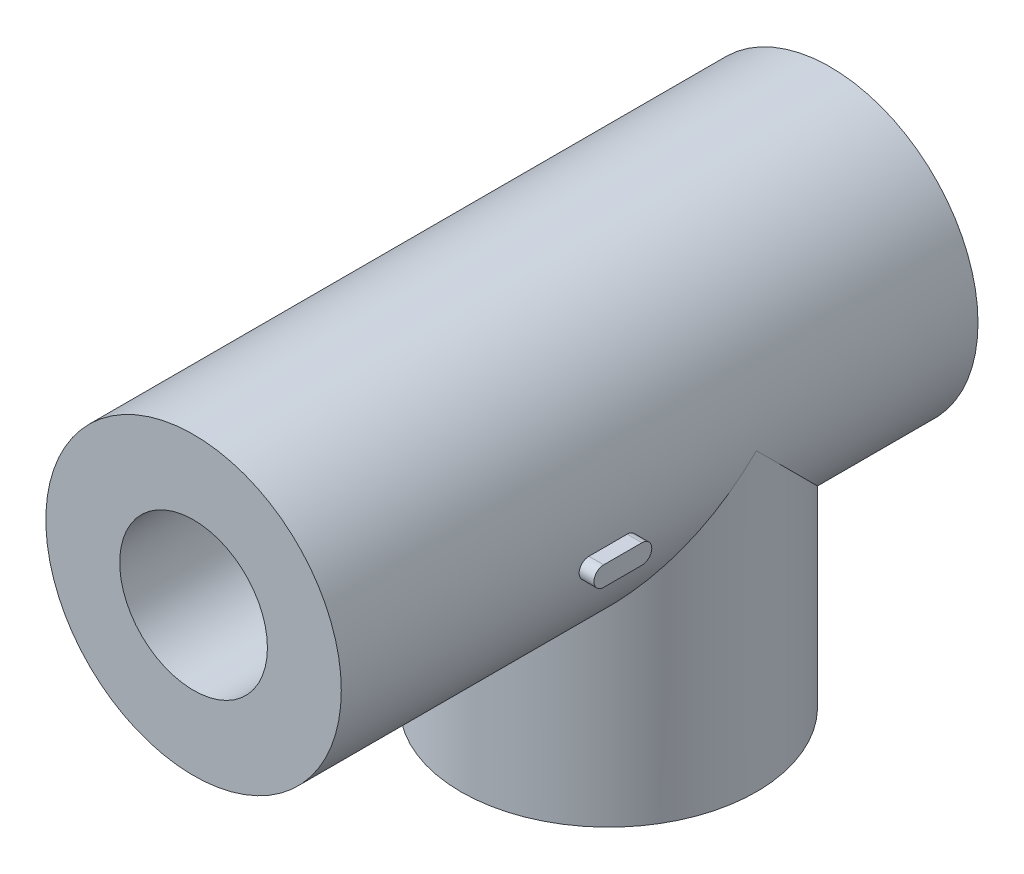
ISO-10303-21;
HEADER;
FILE_DESCRIPTION(('STEP AP214'),'2;1');
FILE_NAME('part.step','',(''),(''),'','','');
FILE_SCHEMA(('AUTOMOTIVE_DESIGN { 1 0 10303 214 1 1 1 1 }'));
ENDSEC;
DATA;
#1=APPLICATION_CONTEXT('core data for automotive mechanical design processes');
#2=APPLICATION_PROTOCOL_DEFINITION('international standard','automotive_design',2000,#1);
#3=PRODUCT_CONTEXT('',#1,'mechanical');
#4=PRODUCT('Part','Part','',(#3));
#5=PRODUCT_RELATED_PRODUCT_CATEGORY('part','',(#4));
#6=PRODUCT_DEFINITION_FORMATION('','',#4);
#7=PRODUCT_DEFINITION_CONTEXT('part definition',#1,'design');
#8=PRODUCT_DEFINITION('design','',#6,#7);
#9=PRODUCT_DEFINITION_SHAPE('','',#8);
#10=(LENGTH_UNIT() NAMED_UNIT(*) SI_UNIT(.MILLI.,.METRE.));
#11=(NAMED_UNIT(*) PLANE_ANGLE_UNIT() SI_UNIT($,.RADIAN.));
#12=(NAMED_UNIT(*) SI_UNIT($,.STERADIAN.) SOLID_ANGLE_UNIT());
#13=UNCERTAINTY_MEASURE_WITH_UNIT(LENGTH_MEASURE(1.E-05),#10,'distance_accuracy_value','');
#14=(GEOMETRIC_REPRESENTATION_CONTEXT(3) GLOBAL_UNCERTAINTY_ASSIGNED_CONTEXT((#13)) GLOBAL_UNIT_ASSIGNED_CONTEXT((#10,
#11,#12)) REPRESENTATION_CONTEXT('',''));
#15=CARTESIAN_POINT('',(0.,0.,0.));
#16=DIRECTION('',(0.,0.,1.));
#17=DIRECTION('',(1.,0.,0.));
#18=AXIS2_PLACEMENT_3D('',#15,#16,#17);
#19=CARTESIAN_POINT('',(22.,-2.35876012931021,52.675133912037));
#20=DIRECTION('',(-1.,0.,0.));
#21=DIRECTION('',(0.,0.,1.));
#22=AXIS2_PLACEMENT_3D('',#19,#20,#21);
#23=CYLINDRICAL_SURFACE('',#22,1.32070812579821);
#24=CARTESIAN_POINT('',(20.,-2.35876012931021,52.675133912037));
#25=DIRECTION('',(1.,0.,0.));
#26=DIRECTION('',(0.,0.,-1.));
#27=AXIS2_PLACEMENT_3D('',#24,#25,#26);
#28=CIRCLE('',#27,1.32070812579821);
#29=CARTESIAN_POINT('',(20.,-1.038052003512,52.675133912037));
#30=VERTEX_POINT('',#29);
#31=CARTESIAN_POINT('',(20.,-3.67946825510842,52.675133912037));
#32=VERTEX_POINT('',#31);
#33=EDGE_CURVE('E117',#30,#32,#28,.T.);
#34=ORIENTED_EDGE('',*,*,#33,.T.);
#35=DIRECTION('',(-1.,0.,0.));
#36=VECTOR('',#35,1.);
#37=CARTESIAN_POINT('',(22.,-3.67946825510842,52.675133912037));
#38=LINE('',#37,#36);
#39=CARTESIAN_POINT('',(22.,-3.67946825510842,52.675133912037));
#40=VERTEX_POINT('',#39);
#41=EDGE_CURVE('E12',#40,#32,#38,.T.);
#42=ORIENTED_EDGE('',*,*,#41,.F.);
#43=CARTESIAN_POINT('',(22.,-2.35876012931021,52.675133912037));
#44=DIRECTION('',(1.,0.,0.));
#45=DIRECTION('',(0.,0.,-1.));
#46=AXIS2_PLACEMENT_3D('',#43,#44,#45);
#47=CIRCLE('',#46,1.32070812579821);
#48=CARTESIAN_POINT('',(22.,-1.038052003512,52.675133912037));
#49=VERTEX_POINT('',#48);
#50=EDGE_CURVE('E105',#49,#40,#47,.T.);
#51=ORIENTED_EDGE('',*,*,#50,.F.);
#52=DIRECTION('',(-1.,0.,0.));
#53=VECTOR('',#52,1.);
#54=CARTESIAN_POINT('',(22.,-1.038052003512,52.675133912037));
#55=LINE('',#54,#53);
#56=EDGE_CURVE('E113',#49,#30,#55,.T.);
#57=ORIENTED_EDGE('',*,*,#56,.T.);
#58=EDGE_LOOP('',(#34,#42,#51,#57));
#59=FACE_BOUND('',#58,.T.);
#60=ADVANCED_FACE('F54',(#59),#23,.T.);
#61=CARTESIAN_POINT('',(22.,-3.67946825510842,52.675133912037));
#62=DIRECTION('',(0.,1.,0.));
#63=DIRECTION('',(0.,0.,1.));
#64=AXIS2_PLACEMENT_3D('',#61,#62,#63);
#65=PLANE('',#64);
#66=DIRECTION('',(0.,0.,-1.));
#67=VECTOR('',#66,1.);
#68=CARTESIAN_POINT('',(20.,-3.67946825510842,52.675133912037));
#69=LINE('',#68,#67);
#70=CARTESIAN_POINT('',(20.,-3.67946825510842,47.4866377035441));
#71=VERTEX_POINT('',#70);
#72=EDGE_CURVE('E109',#32,#71,#69,.T.);
#73=ORIENTED_EDGE('',*,*,#72,.T.);
#74=DIRECTION('',(-1.,0.,0.));
#75=VECTOR('',#74,1.);
#76=CARTESIAN_POINT('',(22.,-3.67946825510842,47.4866377035441));
#77=LINE('',#76,#75);
#78=CARTESIAN_POINT('',(22.,-3.67946825510842,47.4866377035441));
#79=VERTEX_POINT('',#78);
#80=EDGE_CURVE('E62',#79,#71,#77,.T.);
#81=ORIENTED_EDGE('',*,*,#80,.F.);
#82=DIRECTION('',(0.,0.,-1.));
#83=VECTOR('',#82,1.);
#84=CARTESIAN_POINT('',(22.,-3.67946825510842,52.675133912037));
#85=LINE('',#84,#83);
#86=EDGE_CURVE('E100',#40,#79,#85,.T.);
#87=ORIENTED_EDGE('',*,*,#86,.F.);
#88=ORIENTED_EDGE('',*,*,#41,.T.);
#89=EDGE_LOOP('',(#73,#81,#87,#88));
#90=FACE_BOUND('',#89,.T.);
#91=ADVANCED_FACE('F108',(#90),#65,.F.);
#92=CARTESIAN_POINT('',(22.,-2.35876012931021,47.4866377035441));
#93=DIRECTION('',(-1.,0.,0.));
#94=DIRECTION('',(0.,0.,1.));
#95=AXIS2_PLACEMENT_3D('',#92,#93,#94);
#96=CYLINDRICAL_SURFACE('',#95,1.32070812579821);
#97=CARTESIAN_POINT('',(20.,-2.35876012931021,47.4866377035441));
#98=DIRECTION('',(1.,0.,0.));
#99=DIRECTION('',(0.,0.,-1.));
#100=AXIS2_PLACEMENT_3D('',#97,#98,#99);
#101=CIRCLE('',#100,1.32070812579821);
#102=CARTESIAN_POINT('',(20.,-1.038052003512,47.4866377035441));
#103=VERTEX_POINT('',#102);
#104=EDGE_CURVE('E87',#71,#103,#101,.T.);
#105=ORIENTED_EDGE('',*,*,#104,.T.);
#106=DIRECTION('',(-1.,0.,0.));
#107=VECTOR('',#106,1.);
#108=CARTESIAN_POINT('',(22.,-1.038052003512,47.4866377035441));
#109=LINE('',#108,#107);
#110=CARTESIAN_POINT('',(22.,-1.038052003512,47.4866377035441));
#111=VERTEX_POINT('',#110);
#112=EDGE_CURVE('E110',#111,#103,#109,.T.);
#113=ORIENTED_EDGE('',*,*,#112,.F.);
#114=CARTESIAN_POINT('',(22.,-2.35876012931021,47.4866377035441));
#115=DIRECTION('',(1.,0.,0.));
#116=DIRECTION('',(0.,0.,-1.));
#117=AXIS2_PLACEMENT_3D('',#114,#115,#116);
#118=CIRCLE('',#117,1.32070812579821);
#119=EDGE_CURVE('E103',#79,#111,#118,.T.);
#120=ORIENTED_EDGE('',*,*,#119,.F.);
#121=ORIENTED_EDGE('',*,*,#80,.T.);
#122=EDGE_LOOP('',(#105,#113,#120,#121));
#123=FACE_BOUND('',#122,.T.);
#124=ADVANCED_FACE('F111',(#123),#96,.T.);
#125=CARTESIAN_POINT('',(22.,-1.038052003512,52.675133912037));
#126=DIRECTION('',(0.,-1.,0.));
#127=DIRECTION('',(0.,0.,-1.));
#128=AXIS2_PLACEMENT_3D('',#125,#126,#127);
#129=PLANE('',#128);
#130=DIRECTION('',(0.,0.,1.));
#131=VECTOR('',#130,1.);
#132=CARTESIAN_POINT('',(20.,-1.038052003512,52.675133912037));
#133=LINE('',#132,#131);
#134=EDGE_CURVE('E93',#103,#30,#133,.T.);
#135=ORIENTED_EDGE('',*,*,#134,.T.);
#136=ORIENTED_EDGE('',*,*,#56,.F.);
#137=DIRECTION('',(0.,0.,1.));
#138=VECTOR('',#137,1.);
#139=CARTESIAN_POINT('',(22.,-1.038052003512,52.675133912037));
#140=LINE('',#139,#138);
#141=EDGE_CURVE('E70',#111,#49,#140,.T.);
#142=ORIENTED_EDGE('',*,*,#141,.F.);
#143=ORIENTED_EDGE('',*,*,#112,.T.);
#144=EDGE_LOOP('',(#135,#136,#142,#143));
#145=FACE_BOUND('',#144,.T.);
#146=ADVANCED_FACE('F124',(#145),#129,.F.);
#147=CARTESIAN_POINT('',(22.,-2.35876012931021,52.675133912037));
#148=DIRECTION('',(1.,0.,0.));
#149=DIRECTION('',(0.,0.,-1.));
#150=AXIS2_PLACEMENT_3D('',#147,#148,#149);
#151=PLANE('',#150);
#152=ORIENTED_EDGE('',*,*,#50,.T.);
#153=ORIENTED_EDGE('',*,*,#86,.T.);
#154=ORIENTED_EDGE('',*,*,#119,.T.);
#155=ORIENTED_EDGE('',*,*,#141,.T.);
#156=EDGE_LOOP('',(#152,#153,#154,#155));
#157=FACE_BOUND('',#156,.T.);
#158=ADVANCED_FACE('F101',(#157),#151,.T.);
#159=CARTESIAN_POINT('',(20.,-2.35876012931021,52.675133912037));
#160=DIRECTION('',(1.,0.,0.));
#161=DIRECTION('',(0.,0.,-1.));
#162=AXIS2_PLACEMENT_3D('',#159,#160,#161);
#163=PLANE('',#162);
#164=ORIENTED_EDGE('',*,*,#33,.F.);
#165=ORIENTED_EDGE('',*,*,#134,.F.);
#166=ORIENTED_EDGE('',*,*,#104,.F.);
#167=ORIENTED_EDGE('',*,*,#72,.F.);
#168=EDGE_LOOP('',(#164,#165,#166,#167));
#169=FACE_BOUND('',#168,.T.);
#170=ADVANCED_FACE('F127',(#169),#163,.F.);
#171=CLOSED_SHELL('',(#60,#91,#124,#146,#158,#170));
#172=MANIFOLD_SOLID_BREP('B2',#171);
#173=CARTESIAN_POINT('',(0.,0.,86.2));
#174=DIRECTION('',(0.,0.,-1.));
#175=DIRECTION('',(-1.,0.,0.));
#176=AXIS2_PLACEMENT_3D('',#173,#174,#175);
#177=CYLINDRICAL_SURFACE('',#176,20.);
#178=CARTESIAN_POINT('',(0.,0.,30.));
#179=DIRECTION('',(0.,-0.707106781186547,-0.707106781186547));
#180=DIRECTION('',(0.,0.707106781186547,-0.707106781186547));
#181=AXIS2_PLACEMENT_3D('',#178,#179,#180);
#182=ELLIPSE('',#181,28.2842712474619,20.);
#183=CARTESIAN_POINT('',(-20.,0.,30.));
#184=VERTEX_POINT('',#183);
#185=CARTESIAN_POINT('',(20.,0.,30.));
#186=VERTEX_POINT('',#185);
#187=EDGE_CURVE('E197',#184,#186,#182,.F.);
#188=ORIENTED_EDGE('',*,*,#187,.T.);
#189=CARTESIAN_POINT('',(0.,0.,30.));
#190=DIRECTION('',(0.,0.707106781186547,-0.707106781186547));
#191=DIRECTION('',(0.,-0.707106781186547,-0.707106781186547));
#192=AXIS2_PLACEMENT_3D('',#189,#190,#191);
#193=ELLIPSE('',#192,28.2842712474619,20.);
#194=EDGE_CURVE('E52',#186,#184,#193,.T.);
#195=ORIENTED_EDGE('',*,*,#194,.T.);
#196=EDGE_LOOP('',(#188,#195));
#197=FACE_BOUND('',#196,.T.);
#198=CARTESIAN_POINT('',(0.,0.,86.2));
#199=DIRECTION('',(0.,0.,1.));
#200=DIRECTION('',(1.,0.,0.));
#201=AXIS2_PLACEMENT_3D('',#198,#199,#200);
#202=CIRCLE('',#201,20.);
#203=CARTESIAN_POINT('',(20.,0.,86.2));
#204=VERTEX_POINT('',#203);
#205=EDGE_CURVE('E206',#204,#204,#202,.T.);
#206=ORIENTED_EDGE('',*,*,#205,.F.);
#207=EDGE_LOOP('',(#206));
#208=FACE_BOUND('',#207,.T.);
#209=CARTESIAN_POINT('',(0.,0.,0.));
#210=DIRECTION('',(0.,0.,1.));
#211=DIRECTION('',(1.,0.,0.));
#212=AXIS2_PLACEMENT_3D('',#209,#210,#211);
#213=CIRCLE('',#212,20.);
#214=CARTESIAN_POINT('',(20.,0.,0.));
#215=VERTEX_POINT('',#214);
#216=EDGE_CURVE('E215',#215,#215,#213,.T.);
#217=ORIENTED_EDGE('',*,*,#216,.T.);
#218=EDGE_LOOP('',(#217));
#219=FACE_BOUND('',#218,.T.);
#220=ADVANCED_FACE('F189',(#197,#208,#219),#177,.T.);
#221=CARTESIAN_POINT('',(0.,0.,86.2));
#222=DIRECTION('',(0.,0.,1.));
#223=DIRECTION('',(1.,0.,0.));
#224=AXIS2_PLACEMENT_3D('',#221,#222,#223);
#225=PLANE('',#224);
#226=CARTESIAN_POINT('',(0.,0.,86.2));
#227=DIRECTION('',(0.,0.,1.));
#228=DIRECTION('',(1.,0.,0.));
#229=AXIS2_PLACEMENT_3D('',#226,#227,#228);
#230=CIRCLE('',#229,10.);
#231=CARTESIAN_POINT('',(10.,0.,86.2));
#232=VERTEX_POINT('',#231);
#233=EDGE_CURVE('E235',#232,#232,#230,.T.);
#234=ORIENTED_EDGE('',*,*,#233,.F.);
#235=EDGE_LOOP('',(#234));
#236=FACE_BOUND('',#235,.T.);
#237=ORIENTED_EDGE('',*,*,#205,.T.);
#238=EDGE_LOOP('',(#237));
#239=FACE_BOUND('',#238,.T.);
#240=ADVANCED_FACE('F209',(#236,#239),#225,.T.);
#241=CARTESIAN_POINT('',(0.,0.,0.));
#242=DIRECTION('',(0.,0.,1.));
#243=DIRECTION('',(1.,0.,0.));
#244=AXIS2_PLACEMENT_3D('',#241,#242,#243);
#245=PLANE('',#244);
#246=ORIENTED_EDGE('',*,*,#216,.F.);
#247=EDGE_LOOP('',(#246));
#248=FACE_BOUND('',#247,.T.);
#249=ADVANCED_FACE('F254',(#248),#245,.F.);
#250=CARTESIAN_POINT('',(0.,-40.,30.));
#251=DIRECTION('',(0.,1.,0.));
#252=DIRECTION('',(0.,0.,1.));
#253=AXIS2_PLACEMENT_3D('',#250,#251,#252);
#254=CYLINDRICAL_SURFACE('',#253,20.);
#255=CARTESIAN_POINT('',(0.,-40.,30.));
#256=DIRECTION('',(0.,1.,0.));
#257=DIRECTION('',(0.,0.,1.));
#258=AXIS2_PLACEMENT_3D('',#255,#256,#257);
#259=CIRCLE('',#258,20.);
#260=CARTESIAN_POINT('',(0.,-40.,50.));
#261=VERTEX_POINT('',#260);
#262=EDGE_CURVE('E218',#261,#261,#259,.T.);
#263=ORIENTED_EDGE('',*,*,#262,.T.);
#264=EDGE_LOOP('',(#263));
#265=FACE_BOUND('',#264,.T.);
#266=ORIENTED_EDGE('',*,*,#194,.F.);
#267=ORIENTED_EDGE('',*,*,#187,.F.);
#268=EDGE_LOOP('',(#266,#267));
#269=FACE_BOUND('',#268,.T.);
#270=ADVANCED_FACE('F203',(#265,#269),#254,.T.);
#271=CARTESIAN_POINT('',(0.,-40.,30.));
#272=DIRECTION('',(0.,1.,0.));
#273=DIRECTION('',(0.,0.,1.));
#274=AXIS2_PLACEMENT_3D('',#271,#272,#273);
#275=PLANE('',#274);
#276=CARTESIAN_POINT('',(0.,-40.,29.9999999999999));
#277=DIRECTION('',(0.,-1.,0.));
#278=DIRECTION('',(0.,0.,-1.));
#279=AXIS2_PLACEMENT_3D('',#276,#277,#278);
#280=CIRCLE('',#279,10.);
#281=CARTESIAN_POINT('',(0.,-40.,19.9999999999999));
#282=VERTEX_POINT('',#281);
#283=EDGE_CURVE('E227',#282,#282,#280,.T.);
#284=ORIENTED_EDGE('',*,*,#283,.F.);
#285=EDGE_LOOP('',(#284));
#286=FACE_BOUND('',#285,.T.);
#287=ORIENTED_EDGE('',*,*,#262,.F.);
#288=EDGE_LOOP('',(#287));
#289=FACE_BOUND('',#288,.T.);
#290=ADVANCED_FACE('F262',(#286,#289),#275,.F.);
#291=CARTESIAN_POINT('',(0.,-20.,29.9999999999999));
#292=DIRECTION('',(0.,-1.,0.));
#293=DIRECTION('',(0.,0.,-1.));
#294=AXIS2_PLACEMENT_3D('',#291,#292,#293);
#295=CYLINDRICAL_SURFACE('',#294,10.);
#296=CARTESIAN_POINT('',(0.,-20.,29.9999999999999));
#297=DIRECTION('',(0.,-1.,0.));
#298=DIRECTION('',(0.,0.,-1.));
#299=AXIS2_PLACEMENT_3D('',#296,#297,#298);
#300=CIRCLE('',#299,10.);
#301=CARTESIAN_POINT('',(0.,-20.,19.9999999999999));
#302=VERTEX_POINT('',#301);
#303=EDGE_CURVE('E224',#302,#302,#300,.T.);
#304=ORIENTED_EDGE('',*,*,#303,.F.);
#305=EDGE_LOOP('',(#304));
#306=FACE_BOUND('',#305,.T.);
#307=ORIENTED_EDGE('',*,*,#283,.T.);
#308=EDGE_LOOP('',(#307));
#309=FACE_BOUND('',#308,.T.);
#310=ADVANCED_FACE('F266',(#306,#309),#295,.F.);
#311=CARTESIAN_POINT('',(0.,-20.,29.9999999999999));
#312=DIRECTION('',(0.,-1.,0.));
#313=DIRECTION('',(0.,0.,-1.));
#314=AXIS2_PLACEMENT_3D('',#311,#312,#313);
#315=PLANE('',#314);
#316=ORIENTED_EDGE('',*,*,#303,.T.);
#317=EDGE_LOOP('',(#316));
#318=FACE_BOUND('',#317,.T.);
#319=ADVANCED_FACE('F248',(#318),#315,.T.);
#320=CARTESIAN_POINT('',(0.,0.,66.2));
#321=DIRECTION('',(0.,0.,1.));
#322=DIRECTION('',(1.,0.,0.));
#323=AXIS2_PLACEMENT_3D('',#320,#321,#322);
#324=CYLINDRICAL_SURFACE('',#323,10.);
#325=CARTESIAN_POINT('',(0.,0.,66.2));
#326=DIRECTION('',(0.,0.,1.));
#327=DIRECTION('',(1.,0.,0.));
#328=AXIS2_PLACEMENT_3D('',#325,#326,#327);
#329=CIRCLE('',#328,10.);
#330=CARTESIAN_POINT('',(10.,0.,66.2));
#331=VERTEX_POINT('',#330);
#332=EDGE_CURVE('E231',#331,#331,#329,.T.);
#333=ORIENTED_EDGE('',*,*,#332,.F.);
#334=EDGE_LOOP('',(#333));
#335=FACE_BOUND('',#334,.T.);
#336=ORIENTED_EDGE('',*,*,#233,.T.);
#337=EDGE_LOOP('',(#336));
#338=FACE_BOUND('',#337,.T.);
#339=ADVANCED_FACE('F245',(#335,#338),#324,.F.);
#340=CARTESIAN_POINT('',(0.,0.,66.2));
#341=DIRECTION('',(0.,0.,1.));
#342=DIRECTION('',(1.,0.,0.));
#343=AXIS2_PLACEMENT_3D('',#340,#341,#342);
#344=PLANE('',#343);
#345=ORIENTED_EDGE('',*,*,#332,.T.);
#346=EDGE_LOOP('',(#345));
#347=FACE_BOUND('',#346,.T.);
#348=ADVANCED_FACE('F243',(#347),#344,.T.);
#349=CLOSED_SHELL('',(#220,#240,#249,#270,#290,#310,#319,#339,#348));
#350=MANIFOLD_SOLID_BREP('B6',#349);
#351=ADVANCED_BREP_SHAPE_REPRESENTATION('',(#18,#172,#350),#14);
#352=SHAPE_DEFINITION_REPRESENTATION(#9,#351);
ENDSEC;
END-ISO-10303-21;
